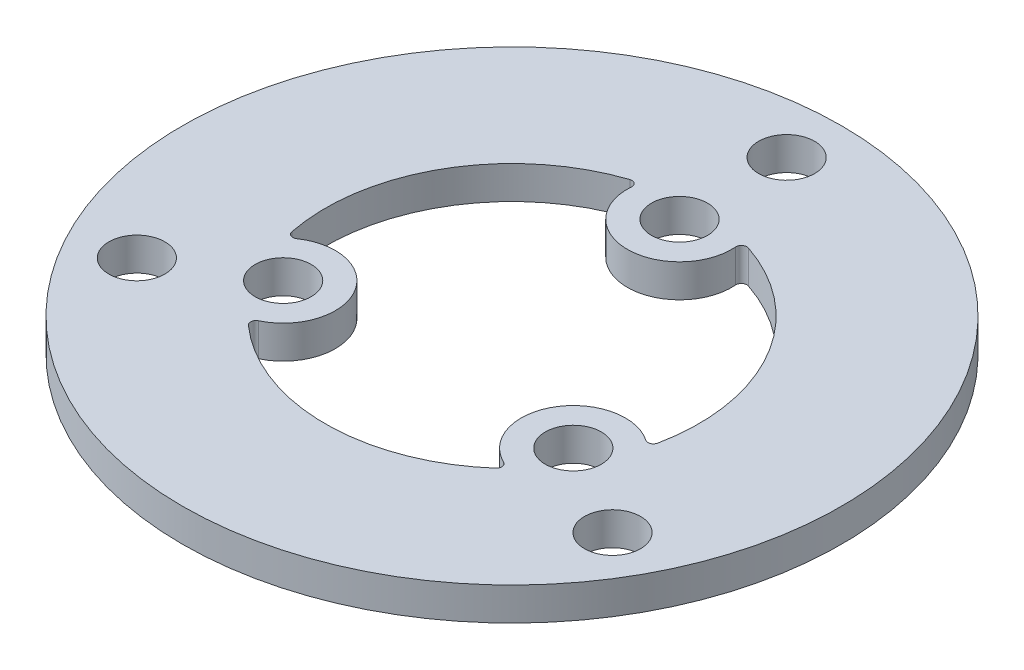
ISO-10303-21;
HEADER;
FILE_DESCRIPTION(('STEP AP214'),'2;1');
FILE_NAME('part.step','',(''),(''),'','','');
FILE_SCHEMA(('AUTOMOTIVE_DESIGN { 1 0 10303 214 1 1 1 1 }'));
ENDSEC;
DATA;
#1=APPLICATION_CONTEXT('core data for automotive mechanical design processes');
#2=APPLICATION_PROTOCOL_DEFINITION('international standard','automotive_design',2000,#1);
#3=PRODUCT_CONTEXT('',#1,'mechanical');
#4=PRODUCT('Part','Part','',(#3));
#5=PRODUCT_RELATED_PRODUCT_CATEGORY('part','',(#4));
#6=PRODUCT_DEFINITION_FORMATION('','',#4);
#7=PRODUCT_DEFINITION_CONTEXT('part definition',#1,'design');
#8=PRODUCT_DEFINITION('design','',#6,#7);
#9=PRODUCT_DEFINITION_SHAPE('','',#8);
#10=(LENGTH_UNIT() NAMED_UNIT(*) SI_UNIT(.MILLI.,.METRE.));
#11=(NAMED_UNIT(*) PLANE_ANGLE_UNIT() SI_UNIT($,.RADIAN.));
#12=(NAMED_UNIT(*) SI_UNIT($,.STERADIAN.) SOLID_ANGLE_UNIT());
#13=UNCERTAINTY_MEASURE_WITH_UNIT(LENGTH_MEASURE(1.E-05),#10,'distance_accuracy_value','');
#14=(GEOMETRIC_REPRESENTATION_CONTEXT(3) GLOBAL_UNCERTAINTY_ASSIGNED_CONTEXT((#13)) GLOBAL_UNIT_ASSIGNED_CONTEXT((#10,
#11,#12)) REPRESENTATION_CONTEXT('',''));
#15=CARTESIAN_POINT('',(0.,0.,0.));
#16=DIRECTION('',(0.,0.,1.));
#17=DIRECTION('',(1.,0.,0.));
#18=AXIS2_PLACEMENT_3D('',#15,#16,#17);
#19=CARTESIAN_POINT('',(0.,3.,0.));
#20=DIRECTION('',(0.,-1.,0.));
#21=DIRECTION('',(0.,0.,-1.));
#22=AXIS2_PLACEMENT_3D('',#19,#20,#21);
#23=CYLINDRICAL_SURFACE('',#22,17.);
#24=CARTESIAN_POINT('',(0.,0.,0.));
#25=DIRECTION('',(0.,1.,0.));
#26=DIRECTION('',(0.,0.,1.));
#27=AXIS2_PLACEMENT_3D('',#24,#25,#26);
#28=CIRCLE('',#27,17.);
#29=CARTESIAN_POINT('',(-5.39356119786705,0.,-16.1217088922007));
#30=VERTEX_POINT('',#29);
#31=CARTESIAN_POINT('',(-16.6585900519968,0.,3.3898934318813));
#32=VERTEX_POINT('',#31);
#33=EDGE_CURVE('E212',#30,#32,#28,.T.);
#34=ORIENTED_EDGE('',*,*,#33,.F.);
#35=DIRECTION('',(0.,-1.,0.));
#36=VECTOR('',#35,1.);
#37=CARTESIAN_POINT('',(-5.39356119786705,3.,-16.1217088922007));
#38=LINE('',#37,#36);
#39=CARTESIAN_POINT('',(-5.39356119786705,3.,-16.1217088922007));
#40=VERTEX_POINT('',#39);
#41=EDGE_CURVE('E172',#30,#40,#38,.F.);
#42=ORIENTED_EDGE('',*,*,#41,.T.);
#43=CARTESIAN_POINT('',(0.,3.,0.));
#44=DIRECTION('',(0.,1.,0.));
#45=DIRECTION('',(0.,0.,1.));
#46=AXIS2_PLACEMENT_3D('',#43,#44,#45);
#47=CIRCLE('',#46,17.);
#48=CARTESIAN_POINT('',(-16.6585900519968,3.,3.3898934318813));
#49=VERTEX_POINT('',#48);
#50=EDGE_CURVE('E197',#40,#49,#47,.T.);
#51=ORIENTED_EDGE('',*,*,#50,.T.);
#52=DIRECTION('',(0.,-1.,0.));
#53=VECTOR('',#52,1.);
#54=CARTESIAN_POINT('',(-16.6585900519968,3.,3.3898934318813));
#55=LINE('',#54,#53);
#56=EDGE_CURVE('E170',#49,#32,#55,.T.);
#57=ORIENTED_EDGE('',*,*,#56,.T.);
#58=EDGE_LOOP('',(#34,#42,#51,#57));
#59=FACE_BOUND('',#58,.T.);
#60=ADVANCED_FACE('F33',(#59),#23,.F.);
#61=CARTESIAN_POINT('',(-11.2650288541299,3.,12.7318154603191));
#62=VERTEX_POINT('',#61);
#63=CARTESIAN_POINT('',(11.2650288541297,3.,12.7318154603193));
#64=VERTEX_POINT('',#63);
#65=EDGE_CURVE('E205',#62,#64,#47,.T.);
#66=ORIENTED_EDGE('',*,*,#65,.T.);
#67=DIRECTION('',(0.,-1.,0.));
#68=VECTOR('',#67,1.);
#69=CARTESIAN_POINT('',(11.2650288541297,3.,12.7318154603193));
#70=LINE('',#69,#68);
#71=CARTESIAN_POINT('',(11.2650288541297,0.,12.7318154603193));
#72=VERTEX_POINT('',#71);
#73=EDGE_CURVE('E153',#64,#72,#70,.T.);
#74=ORIENTED_EDGE('',*,*,#73,.T.);
#75=CARTESIAN_POINT('',(-11.2650288541299,0.,12.7318154603191));
#76=VERTEX_POINT('',#75);
#77=EDGE_CURVE('E131',#76,#72,#28,.T.);
#78=ORIENTED_EDGE('',*,*,#77,.F.);
#79=DIRECTION('',(0.,-1.,0.));
#80=VECTOR('',#79,1.);
#81=CARTESIAN_POINT('',(-11.2650288541299,3.,12.7318154603191));
#82=LINE('',#81,#80);
#83=EDGE_CURVE('E151',#76,#62,#82,.F.);
#84=ORIENTED_EDGE('',*,*,#83,.T.);
#85=EDGE_LOOP('',(#66,#74,#78,#84));
#86=FACE_BOUND('',#85,.T.);
#87=ADVANCED_FACE('F264',(#86),#23,.F.);
#88=CARTESIAN_POINT('',(0.,3.,0.));
#89=DIRECTION('',(0.,1.,0.));
#90=DIRECTION('',(0.,0.,1.));
#91=AXIS2_PLACEMENT_3D('',#88,#89,#90);
#92=PLANE('',#91);
#93=CARTESIAN_POINT('',(21.6506350946109,3.,12.5000000000001));
#94=DIRECTION('',(0.,1.,0.));
#95=DIRECTION('',(-0.866025403784436,0.,-0.500000000000004));
#96=AXIS2_PLACEMENT_3D('',#93,#94,#95);
#97=CIRCLE('',#96,2.55);
#98=CARTESIAN_POINT('',(19.4422703149606,3.,11.2250000000001));
#99=VERTEX_POINT('',#98);
#100=EDGE_CURVE('E445',#99,#99,#97,.T.);
#101=ORIENTED_EDGE('',*,*,#100,.F.);
#102=EDGE_LOOP('',(#101));
#103=FACE_BOUND('',#102,.T.);
#104=CARTESIAN_POINT('',(-21.6506350946111,3.,12.4999999999998));
#105=DIRECTION('',(0.,1.,0.));
#106=DIRECTION('',(0.866025403784443,0.,-0.499999999999992));
#107=AXIS2_PLACEMENT_3D('',#104,#105,#106);
#108=CIRCLE('',#107,2.55);
#109=CARTESIAN_POINT('',(-19.4422703149608,3.,11.2249999999998));
#110=VERTEX_POINT('',#109);
#111=EDGE_CURVE('E450',#110,#110,#108,.T.);
#112=ORIENTED_EDGE('',*,*,#111,.F.);
#113=EDGE_LOOP('',(#112));
#114=FACE_BOUND('',#113,.T.);
#115=CARTESIAN_POINT('',(0.,3.,-25.));
#116=DIRECTION('',(0.,1.,0.));
#117=DIRECTION('',(0.,0.,1.));
#118=AXIS2_PLACEMENT_3D('',#115,#116,#117);
#119=CIRCLE('',#118,2.55);
#120=CARTESIAN_POINT('',(0.,3.,-22.45));
#121=VERTEX_POINT('',#120);
#122=EDGE_CURVE('E225',#121,#121,#119,.T.);
#123=ORIENTED_EDGE('',*,*,#122,.F.);
#124=EDGE_LOOP('',(#123));
#125=FACE_BOUND('',#124,.T.);
#126=CARTESIAN_POINT('',(13.2068874077127,3.,7.62500000000006));
#127=DIRECTION('',(0.,1.,0.));
#128=DIRECTION('',(-0.866025403784436,0.,-0.500000000000004));
#129=AXIS2_PLACEMENT_3D('',#126,#127,#128);
#130=CIRCLE('',#129,2.55);
#131=CARTESIAN_POINT('',(10.9985226280623,3.,6.35000000000005));
#132=VERTEX_POINT('',#131);
#133=EDGE_CURVE('E219',#132,#132,#130,.T.);
#134=ORIENTED_EDGE('',*,*,#133,.F.);
#135=EDGE_LOOP('',(#134));
#136=FACE_BOUND('',#135,.T.);
#137=CARTESIAN_POINT('',(-13.2068874077128,3.,7.62499999999988));
#138=DIRECTION('',(0.,1.,0.));
#139=DIRECTION('',(0.866025403784443,0.,-0.499999999999992));
#140=AXIS2_PLACEMENT_3D('',#137,#138,#139);
#141=CIRCLE('',#140,2.55);
#142=CARTESIAN_POINT('',(-10.9985226280624,3.,6.3499999999999));
#143=VERTEX_POINT('',#142);
#144=EDGE_CURVE('E221',#143,#143,#141,.T.);
#145=ORIENTED_EDGE('',*,*,#144,.F.);
#146=EDGE_LOOP('',(#145));
#147=FACE_BOUND('',#146,.T.);
#148=ORIENTED_EDGE('',*,*,#65,.F.);
#149=CARTESIAN_POINT('',(-10.9337044760672,3.,12.3573502997215));
#150=DIRECTION('',(0.,1.,0.));
#151=DIRECTION('',(0.,0.,1.));
#152=AXIS2_PLACEMENT_3D('',#149,#150,#151);
#153=CIRCLE('',#152,0.5);
#154=CARTESIAN_POINT('',(-11.1501980886049,3.,11.9066502711766));
#155=VERTEX_POINT('',#154);
#156=EDGE_CURVE('E55',#62,#155,#153,.F.);
#157=ORIENTED_EDGE('',*,*,#156,.T.);
#158=CARTESIAN_POINT('',(-13.2068874077128,3.,7.62499999999988));
#159=DIRECTION('',(0.,1.,0.));
#160=DIRECTION('',(0.866025403784443,0.,-0.499999999999992));
#161=AXIS2_PLACEMENT_3D('',#158,#159,#160);
#162=CIRCLE('',#161,4.75);
#163=CARTESIAN_POINT('',(-15.8865606531183,3.,3.70302966637194));
#164=VERTEX_POINT('',#163);
#165=EDGE_CURVE('E199',#155,#164,#162,.T.);
#166=ORIENTED_EDGE('',*,*,#165,.T.);
#167=CARTESIAN_POINT('',(-16.1686315210558,3.,3.29019068388479));
#168=DIRECTION('',(0.,1.,0.));
#169=DIRECTION('',(0.,0.,1.));
#170=AXIS2_PLACEMENT_3D('',#167,#168,#169);
#171=CIRCLE('',#170,0.5);
#172=EDGE_CURVE('E41',#164,#49,#171,.F.);
#173=ORIENTED_EDGE('',*,*,#172,.T.);
#174=ORIENTED_EDGE('',*,*,#50,.F.);
#175=CARTESIAN_POINT('',(-5.2349270449886,3.,-15.6475409836066));
#176=DIRECTION('',(0.,1.,0.));
#177=DIRECTION('',(0.,0.,1.));
#178=AXIS2_PLACEMENT_3D('',#175,#176,#177);
#179=CIRCLE('',#178,0.5);
#180=CARTESIAN_POINT('',(-4.7363625645135,3.,-15.6096799375488));
#181=VERTEX_POINT('',#180);
#182=EDGE_CURVE('E189',#40,#181,#179,.F.);
#183=ORIENTED_EDGE('',*,*,#182,.T.);
#184=CARTESIAN_POINT('',(0.,3.,-15.25));
#185=DIRECTION('',(0.,1.,0.));
#186=DIRECTION('',(0.,0.,1.));
#187=AXIS2_PLACEMENT_3D('',#184,#185,#186);
#188=CIRCLE('',#187,4.75);
#189=CARTESIAN_POINT('',(4.7363625645135,3.,-15.6096799375488));
#190=VERTEX_POINT('',#189);
#191=EDGE_CURVE('E239',#181,#190,#188,.T.);
#192=ORIENTED_EDGE('',*,*,#191,.T.);
#193=CARTESIAN_POINT('',(5.2349270449886,3.,-15.6475409836066));
#194=DIRECTION('',(0.,1.,0.));
#195=DIRECTION('',(0.,0.,1.));
#196=AXIS2_PLACEMENT_3D('',#193,#194,#195);
#197=CIRCLE('',#196,0.5);
#198=CARTESIAN_POINT('',(5.39356119786705,3.,-16.1217088922007));
#199=VERTEX_POINT('',#198);
#200=EDGE_CURVE('E183',#190,#199,#197,.F.);
#201=ORIENTED_EDGE('',*,*,#200,.T.);
#202=CARTESIAN_POINT('',(16.6585900519968,3.,3.38989343188153));
#203=VERTEX_POINT('',#202);
#204=EDGE_CURVE('E207',#203,#199,#47,.T.);
#205=ORIENTED_EDGE('',*,*,#204,.F.);
#206=CARTESIAN_POINT('',(16.1686315210557,3.,3.29019068388502));
#207=DIRECTION('',(0.,1.,0.));
#208=DIRECTION('',(0.,0.,1.));
#209=AXIS2_PLACEMENT_3D('',#206,#207,#208);
#210=CIRCLE('',#209,0.5);
#211=CARTESIAN_POINT('',(15.8865606531183,3.,3.70302966637217));
#212=VERTEX_POINT('',#211);
#213=EDGE_CURVE('E181',#203,#212,#210,.F.);
#214=ORIENTED_EDGE('',*,*,#213,.T.);
#215=CARTESIAN_POINT('',(13.2068874077127,3.,7.62500000000006));
#216=DIRECTION('',(0.,1.,0.));
#217=DIRECTION('',(-0.866025403784436,0.,-0.500000000000004));
#218=AXIS2_PLACEMENT_3D('',#215,#216,#217);
#219=CIRCLE('',#218,4.75);
#220=CARTESIAN_POINT('',(11.1501980886047,3.,11.9066502711767));
#221=VERTEX_POINT('',#220);
#222=EDGE_CURVE('E148',#212,#221,#219,.T.);
#223=ORIENTED_EDGE('',*,*,#222,.T.);
#224=CARTESIAN_POINT('',(10.9337044760671,3.,12.3573502997217));
#225=DIRECTION('',(0.,1.,0.));
#226=DIRECTION('',(0.,0.,1.));
#227=AXIS2_PLACEMENT_3D('',#224,#225,#226);
#228=CIRCLE('',#227,0.5);
#229=EDGE_CURVE('E136',#221,#64,#228,.F.);
#230=ORIENTED_EDGE('',*,*,#229,.T.);
#231=EDGE_LOOP('',(#148,#157,#166,#173,#174,#183,#192,#201,#205,#214,#223,#230));
#232=FACE_BOUND('',#231,.T.);
#233=CARTESIAN_POINT('',(0.,3.,-15.25));
#234=DIRECTION('',(0.,1.,0.));
#235=DIRECTION('',(0.,0.,1.));
#236=AXIS2_PLACEMENT_3D('',#233,#234,#235);
#237=CIRCLE('',#236,2.55);
#238=CARTESIAN_POINT('',(0.,3.,-12.7));
#239=VERTEX_POINT('',#238);
#240=EDGE_CURVE('E235',#239,#239,#237,.T.);
#241=ORIENTED_EDGE('',*,*,#240,.F.);
#242=EDGE_LOOP('',(#241));
#243=FACE_BOUND('',#242,.T.);
#244=CARTESIAN_POINT('',(0.,3.,0.));
#245=DIRECTION('',(0.,1.,0.));
#246=DIRECTION('',(0.,0.,1.));
#247=AXIS2_PLACEMENT_3D('',#244,#245,#246);
#248=CIRCLE('',#247,30.);
#249=CARTESIAN_POINT('',(0.,3.,30.));
#250=VERTEX_POINT('',#249);
#251=EDGE_CURVE('E155',#250,#250,#248,.T.);
#252=ORIENTED_EDGE('',*,*,#251,.T.);
#253=EDGE_LOOP('',(#252));
#254=FACE_BOUND('',#253,.T.);
#255=ADVANCED_FACE('F195',(#103,#114,#125,#136,#147,#232,#243,#254),#92,.T.);
#256=CARTESIAN_POINT('',(0.,0.,0.));
#257=DIRECTION('',(0.,1.,0.));
#258=DIRECTION('',(0.,0.,1.));
#259=AXIS2_PLACEMENT_3D('',#256,#257,#258);
#260=PLANE('',#259);
#261=CARTESIAN_POINT('',(21.6506350946109,0.,12.5000000000001));
#262=DIRECTION('',(0.,1.,0.));
#263=DIRECTION('',(-0.866025403784436,0.,-0.500000000000004));
#264=AXIS2_PLACEMENT_3D('',#261,#262,#263);
#265=CIRCLE('',#264,2.55);
#266=CARTESIAN_POINT('',(19.4422703149606,0.,11.2250000000001));
#267=VERTEX_POINT('',#266);
#268=EDGE_CURVE('E442',#267,#267,#265,.T.);
#269=ORIENTED_EDGE('',*,*,#268,.T.);
#270=EDGE_LOOP('',(#269));
#271=FACE_BOUND('',#270,.T.);
#272=CARTESIAN_POINT('',(-21.6506350946111,0.,12.4999999999998));
#273=DIRECTION('',(0.,1.,0.));
#274=DIRECTION('',(0.866025403784443,0.,-0.499999999999992));
#275=AXIS2_PLACEMENT_3D('',#272,#273,#274);
#276=CIRCLE('',#275,2.55);
#277=CARTESIAN_POINT('',(-19.4422703149608,0.,11.2249999999998));
#278=VERTEX_POINT('',#277);
#279=EDGE_CURVE('E446',#278,#278,#276,.T.);
#280=ORIENTED_EDGE('',*,*,#279,.T.);
#281=EDGE_LOOP('',(#280));
#282=FACE_BOUND('',#281,.T.);
#283=CARTESIAN_POINT('',(0.,0.,-25.));
#284=DIRECTION('',(0.,1.,0.));
#285=DIRECTION('',(0.,0.,1.));
#286=AXIS2_PLACEMENT_3D('',#283,#284,#285);
#287=CIRCLE('',#286,2.55);
#288=CARTESIAN_POINT('',(0.,0.,-22.45));
#289=VERTEX_POINT('',#288);
#290=EDGE_CURVE('E228',#289,#289,#287,.T.);
#291=ORIENTED_EDGE('',*,*,#290,.T.);
#292=EDGE_LOOP('',(#291));
#293=FACE_BOUND('',#292,.T.);
#294=CARTESIAN_POINT('',(-13.2068874077128,0.,7.62499999999988));
#295=DIRECTION('',(0.,1.,0.));
#296=DIRECTION('',(0.,0.,1.));
#297=AXIS2_PLACEMENT_3D('',#294,#295,#296);
#298=CIRCLE('',#297,2.55);
#299=CARTESIAN_POINT('',(-13.2068874077128,0.,10.1749999999999));
#300=VERTEX_POINT('',#299);
#301=EDGE_CURVE('E216',#300,#300,#298,.F.);
#302=ORIENTED_EDGE('',*,*,#301,.F.);
#303=EDGE_LOOP('',(#302));
#304=FACE_BOUND('',#303,.T.);
#305=CARTESIAN_POINT('',(0.,0.,0.));
#306=DIRECTION('',(0.,1.,0.));
#307=DIRECTION('',(0.,0.,1.));
#308=AXIS2_PLACEMENT_3D('',#305,#306,#307);
#309=CIRCLE('',#308,30.);
#310=CARTESIAN_POINT('',(0.,0.,30.));
#311=VERTEX_POINT('',#310);
#312=EDGE_CURVE('E204',#311,#311,#309,.T.);
#313=ORIENTED_EDGE('',*,*,#312,.F.);
#314=EDGE_LOOP('',(#313));
#315=FACE_BOUND('',#314,.T.);
#316=CARTESIAN_POINT('',(0.,0.,-15.25));
#317=DIRECTION('',(0.,1.,0.));
#318=DIRECTION('',(0.,0.,1.));
#319=AXIS2_PLACEMENT_3D('',#316,#317,#318);
#320=CIRCLE('',#319,4.75);
#321=CARTESIAN_POINT('',(4.7363625645135,0.,-15.6096799375488));
#322=VERTEX_POINT('',#321);
#323=CARTESIAN_POINT('',(-4.7363625645135,0.,-15.6096799375488));
#324=VERTEX_POINT('',#323);
#325=EDGE_CURVE('E236',#322,#324,#320,.F.);
#326=ORIENTED_EDGE('',*,*,#325,.T.);
#327=CARTESIAN_POINT('',(-5.2349270449886,0.,-15.6475409836066));
#328=DIRECTION('',(0.,1.,0.));
#329=DIRECTION('',(0.,0.,1.));
#330=AXIS2_PLACEMENT_3D('',#327,#328,#329);
#331=CIRCLE('',#330,0.5);
#332=EDGE_CURVE('E187',#324,#30,#331,.T.);
#333=ORIENTED_EDGE('',*,*,#332,.T.);
#334=ORIENTED_EDGE('',*,*,#33,.T.);
#335=CARTESIAN_POINT('',(-16.1686315210558,0.,3.29019068388479));
#336=DIRECTION('',(0.,1.,0.));
#337=DIRECTION('',(0.,0.,1.));
#338=AXIS2_PLACEMENT_3D('',#335,#336,#337);
#339=CIRCLE('',#338,0.5);
#340=CARTESIAN_POINT('',(-15.8865606531183,0.,3.70302966637194));
#341=VERTEX_POINT('',#340);
#342=EDGE_CURVE('E11',#32,#341,#339,.T.);
#343=ORIENTED_EDGE('',*,*,#342,.T.);
#344=CARTESIAN_POINT('',(-13.2068874077128,0.,7.62499999999988));
#345=DIRECTION('',(0.,1.,0.));
#346=DIRECTION('',(0.,0.,1.));
#347=AXIS2_PLACEMENT_3D('',#344,#345,#346);
#348=CIRCLE('',#347,4.75);
#349=CARTESIAN_POINT('',(-11.1501980886049,0.,11.9066502711766));
#350=VERTEX_POINT('',#349);
#351=EDGE_CURVE('E211',#341,#350,#348,.F.);
#352=ORIENTED_EDGE('',*,*,#351,.T.);
#353=CARTESIAN_POINT('',(-10.9337044760672,0.,12.3573502997215));
#354=DIRECTION('',(0.,1.,0.));
#355=DIRECTION('',(0.,0.,1.));
#356=AXIS2_PLACEMENT_3D('',#353,#354,#355);
#357=CIRCLE('',#356,0.5);
#358=EDGE_CURVE('E191',#350,#76,#357,.T.);
#359=ORIENTED_EDGE('',*,*,#358,.T.);
#360=ORIENTED_EDGE('',*,*,#77,.T.);
#361=CARTESIAN_POINT('',(10.9337044760671,0.,12.3573502997217));
#362=DIRECTION('',(0.,1.,0.));
#363=DIRECTION('',(0.,0.,1.));
#364=AXIS2_PLACEMENT_3D('',#361,#362,#363);
#365=CIRCLE('',#364,0.5);
#366=CARTESIAN_POINT('',(11.1501980886047,0.,11.9066502711767));
#367=VERTEX_POINT('',#366);
#368=EDGE_CURVE('E124',#72,#367,#365,.T.);
#369=ORIENTED_EDGE('',*,*,#368,.T.);
#370=CARTESIAN_POINT('',(13.2068874077127,0.,7.62500000000006));
#371=DIRECTION('',(0.,1.,0.));
#372=DIRECTION('',(0.,0.,1.));
#373=AXIS2_PLACEMENT_3D('',#370,#371,#372);
#374=CIRCLE('',#373,4.75);
#375=CARTESIAN_POINT('',(15.8865606531183,0.,3.70302966637217));
#376=VERTEX_POINT('',#375);
#377=EDGE_CURVE('E129',#367,#376,#374,.F.);
#378=ORIENTED_EDGE('',*,*,#377,.T.);
#379=CARTESIAN_POINT('',(16.1686315210557,0.,3.29019068388502));
#380=DIRECTION('',(0.,1.,0.));
#381=DIRECTION('',(0.,0.,1.));
#382=AXIS2_PLACEMENT_3D('',#379,#380,#381);
#383=CIRCLE('',#382,0.5);
#384=CARTESIAN_POINT('',(16.6585900519968,0.,3.38989343188153));
#385=VERTEX_POINT('',#384);
#386=EDGE_CURVE('E135',#376,#385,#383,.T.);
#387=ORIENTED_EDGE('',*,*,#386,.T.);
#388=CARTESIAN_POINT('',(5.39356119786705,0.,-16.1217088922007));
#389=VERTEX_POINT('',#388);
#390=EDGE_CURVE('E245',#385,#389,#28,.T.);
#391=ORIENTED_EDGE('',*,*,#390,.T.);
#392=CARTESIAN_POINT('',(5.2349270449886,0.,-15.6475409836066));
#393=DIRECTION('',(0.,1.,0.));
#394=DIRECTION('',(0.,0.,1.));
#395=AXIS2_PLACEMENT_3D('',#392,#393,#394);
#396=CIRCLE('',#395,0.5);
#397=EDGE_CURVE('E185',#389,#322,#396,.T.);
#398=ORIENTED_EDGE('',*,*,#397,.T.);
#399=EDGE_LOOP('',(#326,#333,#334,#343,#352,#359,#360,#369,#378,#387,#391,#398));
#400=FACE_BOUND('',#399,.T.);
#401=CARTESIAN_POINT('',(0.,0.,-15.25));
#402=DIRECTION('',(0.,1.,0.));
#403=DIRECTION('',(0.,0.,1.));
#404=AXIS2_PLACEMENT_3D('',#401,#402,#403);
#405=CIRCLE('',#404,2.55);
#406=CARTESIAN_POINT('',(0.,0.,-12.7));
#407=VERTEX_POINT('',#406);
#408=EDGE_CURVE('E238',#407,#407,#405,.F.);
#409=ORIENTED_EDGE('',*,*,#408,.F.);
#410=EDGE_LOOP('',(#409));
#411=FACE_BOUND('',#410,.T.);
#412=CARTESIAN_POINT('',(13.2068874077127,0.,7.62500000000006));
#413=DIRECTION('',(0.,1.,0.));
#414=DIRECTION('',(0.,0.,1.));
#415=AXIS2_PLACEMENT_3D('',#412,#413,#414);
#416=CIRCLE('',#415,2.55);
#417=CARTESIAN_POINT('',(13.2068874077127,0.,10.1750000000001));
#418=VERTEX_POINT('',#417);
#419=EDGE_CURVE('E147',#418,#418,#416,.F.);
#420=ORIENTED_EDGE('',*,*,#419,.F.);
#421=EDGE_LOOP('',(#420));
#422=FACE_BOUND('',#421,.T.);
#423=ADVANCED_FACE('F127',(#271,#282,#293,#304,#315,#400,#411,#422),#260,.F.);
#424=CARTESIAN_POINT('',(0.,3.,0.));
#425=DIRECTION('',(0.,-1.,0.));
#426=DIRECTION('',(0.,0.,-1.));
#427=AXIS2_PLACEMENT_3D('',#424,#425,#426);
#428=CYLINDRICAL_SURFACE('',#427,30.);
#429=ORIENTED_EDGE('',*,*,#251,.F.);
#430=EDGE_LOOP('',(#429));
#431=FACE_BOUND('',#430,.T.);
#432=ORIENTED_EDGE('',*,*,#312,.T.);
#433=EDGE_LOOP('',(#432));
#434=FACE_BOUND('',#433,.T.);
#435=ADVANCED_FACE('F252',(#431,#434),#428,.T.);
#436=ORIENTED_EDGE('',*,*,#390,.F.);
#437=DIRECTION('',(0.,-1.,0.));
#438=VECTOR('',#437,1.);
#439=CARTESIAN_POINT('',(16.6585900519968,3.,3.38989343188153));
#440=LINE('',#439,#438);
#441=EDGE_CURVE('E162',#385,#203,#440,.F.);
#442=ORIENTED_EDGE('',*,*,#441,.T.);
#443=ORIENTED_EDGE('',*,*,#204,.T.);
#444=DIRECTION('',(0.,-1.,0.));
#445=VECTOR('',#444,1.);
#446=CARTESIAN_POINT('',(5.39356119786705,3.,-16.1217088922007));
#447=LINE('',#446,#445);
#448=EDGE_CURVE('E160',#199,#389,#447,.T.);
#449=ORIENTED_EDGE('',*,*,#448,.T.);
#450=EDGE_LOOP('',(#436,#442,#443,#449));
#451=FACE_BOUND('',#450,.T.);
#452=ADVANCED_FACE('F261',(#451),#23,.F.);
#453=CARTESIAN_POINT('',(0.,-13.4350288425444,-15.25));
#454=DIRECTION('',(0.,1.,0.));
#455=DIRECTION('',(0.,0.,1.));
#456=AXIS2_PLACEMENT_3D('',#453,#454,#455);
#457=CYLINDRICAL_SURFACE('',#456,4.75);
#458=ORIENTED_EDGE('',*,*,#325,.F.);
#459=DIRECTION('',(0.,1.,0.));
#460=VECTOR('',#459,1.);
#461=CARTESIAN_POINT('',(4.7363625645135,-13.4350288425444,-15.6096799375488));
#462=LINE('',#461,#460);
#463=EDGE_CURVE('E167',#322,#190,#462,.T.);
#464=ORIENTED_EDGE('',*,*,#463,.T.);
#465=ORIENTED_EDGE('',*,*,#191,.F.);
#466=DIRECTION('',(0.,1.,0.));
#467=VECTOR('',#466,1.);
#468=CARTESIAN_POINT('',(-4.7363625645135,-13.4350288425444,-15.6096799375488));
#469=LINE('',#468,#467);
#470=EDGE_CURVE('E164',#181,#324,#469,.F.);
#471=ORIENTED_EDGE('',*,*,#470,.T.);
#472=EDGE_LOOP('',(#458,#464,#465,#471));
#473=FACE_BOUND('',#472,.T.);
#474=ADVANCED_FACE('F277',(#473),#457,.T.);
#475=CARTESIAN_POINT('',(0.,-13.4350288425444,-15.25));
#476=DIRECTION('',(0.,1.,0.));
#477=DIRECTION('',(0.,0.,1.));
#478=AXIS2_PLACEMENT_3D('',#475,#476,#477);
#479=CYLINDRICAL_SURFACE('',#478,2.55);
#480=ORIENTED_EDGE('',*,*,#240,.T.);
#481=EDGE_LOOP('',(#480));
#482=FACE_BOUND('',#481,.T.);
#483=ORIENTED_EDGE('',*,*,#408,.T.);
#484=EDGE_LOOP('',(#483));
#485=FACE_BOUND('',#484,.T.);
#486=ADVANCED_FACE('F282',(#482,#485),#479,.F.);
#487=CARTESIAN_POINT('',(13.2068874077127,-13.4350288425444,7.62500000000006));
#488=DIRECTION('',(0.,1.,0.));
#489=DIRECTION('',(0.,0.,1.));
#490=AXIS2_PLACEMENT_3D('',#487,#488,#489);
#491=CYLINDRICAL_SURFACE('',#490,4.75);
#492=ORIENTED_EDGE('',*,*,#377,.F.);
#493=DIRECTION('',(0.,1.,0.));
#494=VECTOR('',#493,1.);
#495=CARTESIAN_POINT('',(11.1501980886047,-13.4350288425444,11.9066502711767));
#496=LINE('',#495,#494);
#497=EDGE_CURVE('E143',#367,#221,#496,.T.);
#498=ORIENTED_EDGE('',*,*,#497,.T.);
#499=ORIENTED_EDGE('',*,*,#222,.F.);
#500=DIRECTION('',(0.,1.,0.));
#501=VECTOR('',#500,1.);
#502=CARTESIAN_POINT('',(15.8865606531183,-13.4350288425444,3.70302966637217));
#503=LINE('',#502,#501);
#504=EDGE_CURVE('E146',#212,#376,#503,.F.);
#505=ORIENTED_EDGE('',*,*,#504,.T.);
#506=EDGE_LOOP('',(#492,#498,#499,#505));
#507=FACE_BOUND('',#506,.T.);
#508=ADVANCED_FACE('F141',(#507),#491,.T.);
#509=CARTESIAN_POINT('',(13.2068874077127,-13.4350288425444,7.62500000000006));
#510=DIRECTION('',(0.,1.,0.));
#511=DIRECTION('',(0.,0.,1.));
#512=AXIS2_PLACEMENT_3D('',#509,#510,#511);
#513=CYLINDRICAL_SURFACE('',#512,2.55);
#514=ORIENTED_EDGE('',*,*,#133,.T.);
#515=EDGE_LOOP('',(#514));
#516=FACE_BOUND('',#515,.T.);
#517=ORIENTED_EDGE('',*,*,#419,.T.);
#518=EDGE_LOOP('',(#517));
#519=FACE_BOUND('',#518,.T.);
#520=ADVANCED_FACE('F324',(#516,#519),#513,.F.);
#521=CARTESIAN_POINT('',(-13.2068874077128,-13.4350288425444,7.62499999999988));
#522=DIRECTION('',(0.,1.,0.));
#523=DIRECTION('',(0.,0.,1.));
#524=AXIS2_PLACEMENT_3D('',#521,#522,#523);
#525=CYLINDRICAL_SURFACE('',#524,4.75);
#526=ORIENTED_EDGE('',*,*,#165,.F.);
#527=DIRECTION('',(0.,1.,0.));
#528=VECTOR('',#527,1.);
#529=CARTESIAN_POINT('',(-11.1501980886049,-13.4350288425444,11.9066502711766));
#530=LINE('',#529,#528);
#531=EDGE_CURVE('E176',#155,#350,#530,.F.);
#532=ORIENTED_EDGE('',*,*,#531,.T.);
#533=ORIENTED_EDGE('',*,*,#351,.F.);
#534=DIRECTION('',(0.,1.,0.));
#535=VECTOR('',#534,1.);
#536=CARTESIAN_POINT('',(-15.8865606531183,-13.4350288425444,3.70302966637194));
#537=LINE('',#536,#535);
#538=EDGE_CURVE('E174',#341,#164,#537,.T.);
#539=ORIENTED_EDGE('',*,*,#538,.T.);
#540=EDGE_LOOP('',(#526,#532,#533,#539));
#541=FACE_BOUND('',#540,.T.);
#542=ADVANCED_FACE('F214',(#541),#525,.T.);
#543=CARTESIAN_POINT('',(-13.2068874077128,-13.4350288425444,7.62499999999988));
#544=DIRECTION('',(0.,1.,0.));
#545=DIRECTION('',(0.,0.,1.));
#546=AXIS2_PLACEMENT_3D('',#543,#544,#545);
#547=CYLINDRICAL_SURFACE('',#546,2.55);
#548=ORIENTED_EDGE('',*,*,#144,.T.);
#549=EDGE_LOOP('',(#548));
#550=FACE_BOUND('',#549,.T.);
#551=ORIENTED_EDGE('',*,*,#301,.T.);
#552=EDGE_LOOP('',(#551));
#553=FACE_BOUND('',#552,.T.);
#554=ADVANCED_FACE('F315',(#550,#553),#547,.F.);
#555=CARTESIAN_POINT('',(10.9337044760671,3.,12.3573502997217));
#556=DIRECTION('',(0.,1.,0.));
#557=DIRECTION('',(0.,0.,1.));
#558=AXIS2_PLACEMENT_3D('',#555,#556,#557);
#559=CYLINDRICAL_SURFACE('',#558,0.5);
#560=ORIENTED_EDGE('',*,*,#368,.F.);
#561=ORIENTED_EDGE('',*,*,#73,.F.);
#562=ORIENTED_EDGE('',*,*,#229,.F.);
#563=ORIENTED_EDGE('',*,*,#497,.F.);
#564=EDGE_LOOP('',(#560,#561,#562,#563));
#565=FACE_BOUND('',#564,.T.);
#566=ADVANCED_FACE('F150',(#565),#559,.F.);
#567=CARTESIAN_POINT('',(16.1686315210557,3.,3.29019068388502));
#568=DIRECTION('',(0.,-1.,0.));
#569=DIRECTION('',(0.,0.,-1.));
#570=AXIS2_PLACEMENT_3D('',#567,#568,#569);
#571=CYLINDRICAL_SURFACE('',#570,0.5);
#572=ORIENTED_EDGE('',*,*,#213,.F.);
#573=ORIENTED_EDGE('',*,*,#441,.F.);
#574=ORIENTED_EDGE('',*,*,#386,.F.);
#575=ORIENTED_EDGE('',*,*,#504,.F.);
#576=EDGE_LOOP('',(#572,#573,#574,#575));
#577=FACE_BOUND('',#576,.T.);
#578=ADVANCED_FACE('F293',(#577),#571,.F.);
#579=CARTESIAN_POINT('',(5.2349270449886,3.,-15.6475409836066));
#580=DIRECTION('',(0.,1.,0.));
#581=DIRECTION('',(0.,0.,1.));
#582=AXIS2_PLACEMENT_3D('',#579,#580,#581);
#583=CYLINDRICAL_SURFACE('',#582,0.5);
#584=ORIENTED_EDGE('',*,*,#397,.F.);
#585=ORIENTED_EDGE('',*,*,#448,.F.);
#586=ORIENTED_EDGE('',*,*,#200,.F.);
#587=ORIENTED_EDGE('',*,*,#463,.F.);
#588=EDGE_LOOP('',(#584,#585,#586,#587));
#589=FACE_BOUND('',#588,.T.);
#590=ADVANCED_FACE('F305',(#589),#583,.F.);
#591=CARTESIAN_POINT('',(-5.2349270449886,3.,-15.6475409836066));
#592=DIRECTION('',(0.,-1.,0.));
#593=DIRECTION('',(0.,0.,-1.));
#594=AXIS2_PLACEMENT_3D('',#591,#592,#593);
#595=CYLINDRICAL_SURFACE('',#594,0.5);
#596=ORIENTED_EDGE('',*,*,#182,.F.);
#597=ORIENTED_EDGE('',*,*,#41,.F.);
#598=ORIENTED_EDGE('',*,*,#332,.F.);
#599=ORIENTED_EDGE('',*,*,#470,.F.);
#600=EDGE_LOOP('',(#596,#597,#598,#599));
#601=FACE_BOUND('',#600,.T.);
#602=ADVANCED_FACE('F299',(#601),#595,.F.);
#603=CARTESIAN_POINT('',(-10.9337044760672,3.,12.3573502997215));
#604=DIRECTION('',(0.,-1.,0.));
#605=DIRECTION('',(0.,0.,-1.));
#606=AXIS2_PLACEMENT_3D('',#603,#604,#605);
#607=CYLINDRICAL_SURFACE('',#606,0.5);
#608=ORIENTED_EDGE('',*,*,#156,.F.);
#609=ORIENTED_EDGE('',*,*,#83,.F.);
#610=ORIENTED_EDGE('',*,*,#358,.F.);
#611=ORIENTED_EDGE('',*,*,#531,.F.);
#612=EDGE_LOOP('',(#608,#609,#610,#611));
#613=FACE_BOUND('',#612,.T.);
#614=ADVANCED_FACE('F297',(#613),#607,.F.);
#615=CARTESIAN_POINT('',(-16.1686315210558,3.,3.29019068388479));
#616=DIRECTION('',(0.,1.,0.));
#617=DIRECTION('',(0.,0.,1.));
#618=AXIS2_PLACEMENT_3D('',#615,#616,#617);
#619=CYLINDRICAL_SURFACE('',#618,0.5);
#620=ORIENTED_EDGE('',*,*,#342,.F.);
#621=ORIENTED_EDGE('',*,*,#56,.F.);
#622=ORIENTED_EDGE('',*,*,#172,.F.);
#623=ORIENTED_EDGE('',*,*,#538,.F.);
#624=EDGE_LOOP('',(#620,#621,#622,#623));
#625=FACE_BOUND('',#624,.T.);
#626=ADVANCED_FACE('F35',(#625),#619,.F.);
#627=CARTESIAN_POINT('',(0.,0.,-25.));
#628=DIRECTION('',(0.,1.,0.));
#629=DIRECTION('',(0.,0.,1.));
#630=AXIS2_PLACEMENT_3D('',#627,#628,#629);
#631=CYLINDRICAL_SURFACE('',#630,2.55);
#632=ORIENTED_EDGE('',*,*,#290,.F.);
#633=EDGE_LOOP('',(#632));
#634=FACE_BOUND('',#633,.T.);
#635=ORIENTED_EDGE('',*,*,#122,.T.);
#636=EDGE_LOOP('',(#635));
#637=FACE_BOUND('',#636,.T.);
#638=ADVANCED_FACE('F304',(#634,#637),#631,.F.);
#639=CARTESIAN_POINT('',(-21.6506350946111,0.,12.4999999999998));
#640=DIRECTION('',(0.,1.,0.));
#641=DIRECTION('',(0.,0.,1.));
#642=AXIS2_PLACEMENT_3D('',#639,#640,#641);
#643=CYLINDRICAL_SURFACE('',#642,2.55);
#644=ORIENTED_EDGE('',*,*,#279,.F.);
#645=EDGE_LOOP('',(#644));
#646=FACE_BOUND('',#645,.T.);
#647=ORIENTED_EDGE('',*,*,#111,.T.);
#648=EDGE_LOOP('',(#647));
#649=FACE_BOUND('',#648,.T.);
#650=ADVANCED_FACE('F406',(#646,#649),#643,.F.);
#651=CARTESIAN_POINT('',(21.6506350946109,0.,12.5000000000001));
#652=DIRECTION('',(0.,1.,0.));
#653=DIRECTION('',(0.,0.,1.));
#654=AXIS2_PLACEMENT_3D('',#651,#652,#653);
#655=CYLINDRICAL_SURFACE('',#654,2.55);
#656=ORIENTED_EDGE('',*,*,#268,.F.);
#657=EDGE_LOOP('',(#656));
#658=FACE_BOUND('',#657,.T.);
#659=ORIENTED_EDGE('',*,*,#100,.T.);
#660=EDGE_LOOP('',(#659));
#661=FACE_BOUND('',#660,.T.);
#662=ADVANCED_FACE('F427',(#658,#661),#655,.F.);
#663=CLOSED_SHELL('',(#60,#87,#255,#423,#435,#452,#474,#486,#508,#520,#542,#554,#566,#578,#590,
#602,#614,#626,#638,#650,#662));
#664=MANIFOLD_SOLID_BREP('B2',#663);
#665=ADVANCED_BREP_SHAPE_REPRESENTATION('',(#18,#664),#14);
#666=SHAPE_DEFINITION_REPRESENTATION(#9,#665);
ENDSEC;
END-ISO-10303-21;
